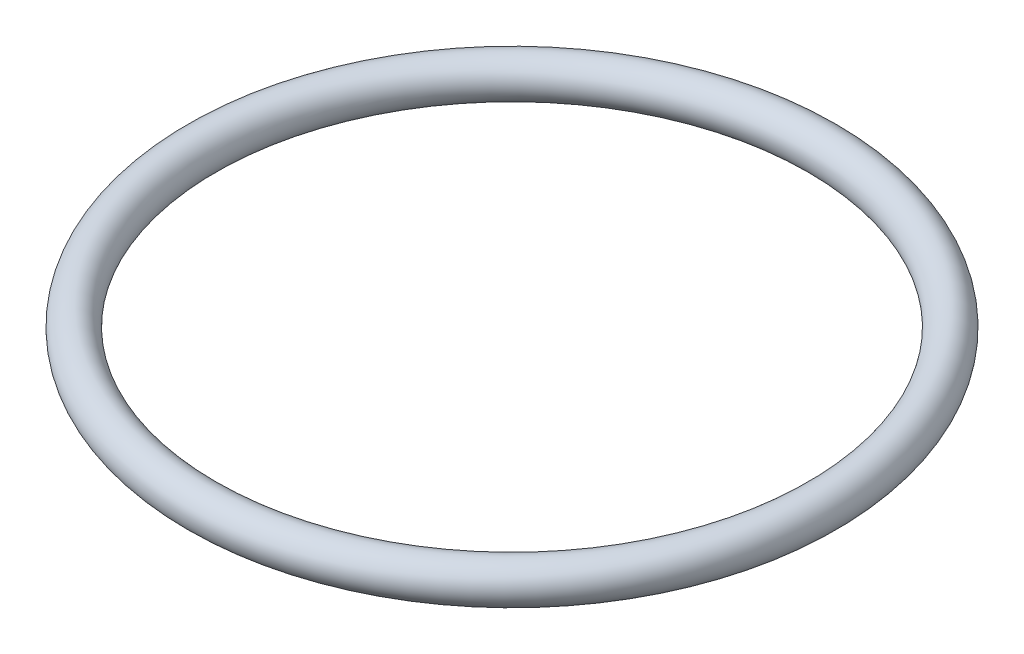
ISO-10303-21;
HEADER;
FILE_DESCRIPTION(('STEP AP214'),'2;1');
FILE_NAME('part.step','',(''),(''),'','','');
FILE_SCHEMA(('AUTOMOTIVE_DESIGN { 1 0 10303 214 1 1 1 1 }'));
ENDSEC;
DATA;
#1=APPLICATION_CONTEXT('core data for automotive mechanical design processes');
#2=APPLICATION_PROTOCOL_DEFINITION('international standard','automotive_design',2000,#1);
#3=PRODUCT_CONTEXT('',#1,'mechanical');
#4=PRODUCT('Part','Part','',(#3));
#5=PRODUCT_RELATED_PRODUCT_CATEGORY('part','',(#4));
#6=PRODUCT_DEFINITION_FORMATION('','',#4);
#7=PRODUCT_DEFINITION_CONTEXT('part definition',#1,'design');
#8=PRODUCT_DEFINITION('design','',#6,#7);
#9=PRODUCT_DEFINITION_SHAPE('','',#8);
#10=(LENGTH_UNIT() NAMED_UNIT(*) SI_UNIT(.MILLI.,.METRE.));
#11=(NAMED_UNIT(*) PLANE_ANGLE_UNIT() SI_UNIT($,.RADIAN.));
#12=(NAMED_UNIT(*) SI_UNIT($,.STERADIAN.) SOLID_ANGLE_UNIT());
#13=UNCERTAINTY_MEASURE_WITH_UNIT(LENGTH_MEASURE(1.E-05),#10,'distance_accuracy_value','');
#14=(GEOMETRIC_REPRESENTATION_CONTEXT(3) GLOBAL_UNCERTAINTY_ASSIGNED_CONTEXT((#13)) GLOBAL_UNIT_ASSIGNED_CONTEXT((#10,
#11,#12)) REPRESENTATION_CONTEXT('',''));
#15=CARTESIAN_POINT('',(0.,0.,0.));
#16=DIRECTION('',(0.,0.,1.));
#17=DIRECTION('',(1.,0.,0.));
#18=AXIS2_PLACEMENT_3D('',#15,#16,#17);
#19=CARTESIAN_POINT('',(0.,0.,42.035));
#20=DIRECTION('',(0.,1.,0.));
#21=DIRECTION('',(0.,0.,1.));
#22=AXIS2_PLACEMENT_3D('',#19,#20,#21);
#23=TOROIDAL_SURFACE('',#22,42.035,2.665);
#24=CARTESIAN_POINT('',(0.,0.,86.735));
#25=VERTEX_POINT('',#24);
#26=VERTEX_LOOP('',#25);
#27=FACE_BOUND('',#26,.T.);
#28=ADVANCED_FACE('F33',(#27),#23,.T.);
#29=CLOSED_SHELL('',(#28));
#30=MANIFOLD_SOLID_BREP('B2',#29);
#31=ADVANCED_BREP_SHAPE_REPRESENTATION('',(#18,#30),#14);
#32=SHAPE_DEFINITION_REPRESENTATION(#9,#31);
ENDSEC;
END-ISO-10303-21;
